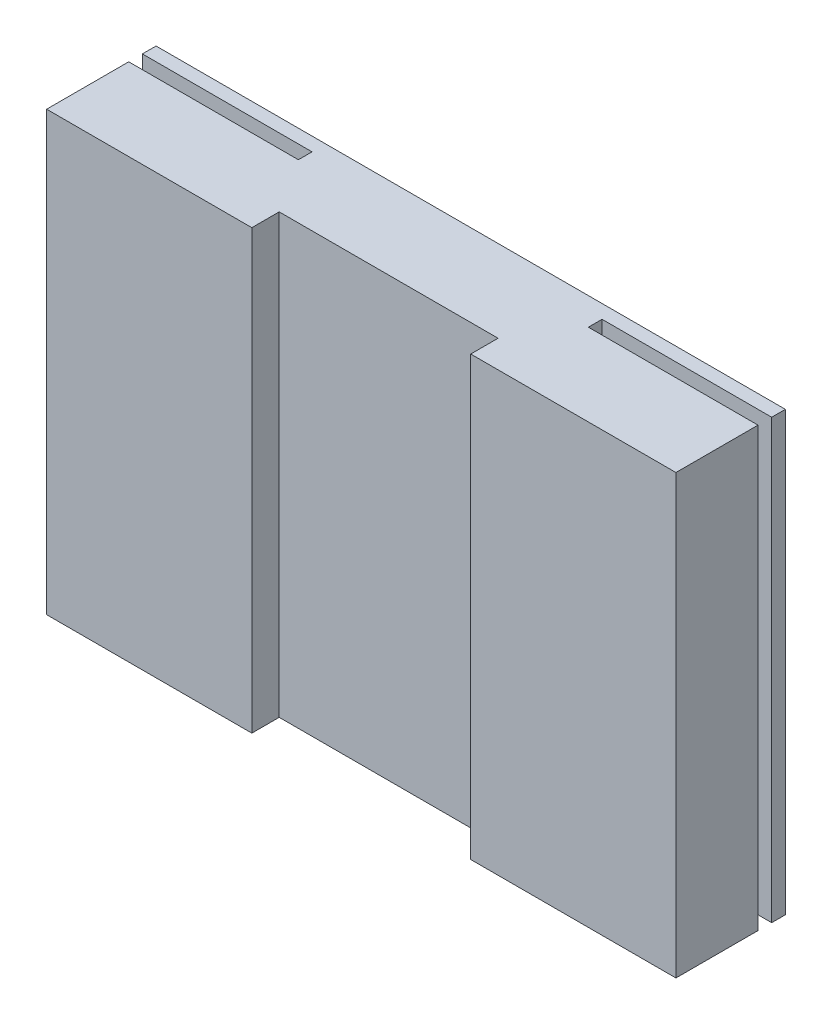
ISO-10303-21;
HEADER;
FILE_DESCRIPTION(('STEP AP214'),'2;1');
FILE_NAME('part.step','',(''),(''),'','','');
FILE_SCHEMA(('AUTOMOTIVE_DESIGN { 1 0 10303 214 1 1 1 1 }'));
ENDSEC;
DATA;
#1=APPLICATION_CONTEXT('core data for automotive mechanical design processes');
#2=APPLICATION_PROTOCOL_DEFINITION('international standard','automotive_design',2000,#1);
#3=PRODUCT_CONTEXT('',#1,'mechanical');
#4=PRODUCT('Part','Part','',(#3));
#5=PRODUCT_RELATED_PRODUCT_CATEGORY('part','',(#4));
#6=PRODUCT_DEFINITION_FORMATION('','',#4);
#7=PRODUCT_DEFINITION_CONTEXT('part definition',#1,'design');
#8=PRODUCT_DEFINITION('design','',#6,#7);
#9=PRODUCT_DEFINITION_SHAPE('','',#8);
#10=(LENGTH_UNIT() NAMED_UNIT(*) SI_UNIT(.MILLI.,.METRE.));
#11=(NAMED_UNIT(*) PLANE_ANGLE_UNIT() SI_UNIT($,.RADIAN.));
#12=(NAMED_UNIT(*) SI_UNIT($,.STERADIAN.) SOLID_ANGLE_UNIT());
#13=UNCERTAINTY_MEASURE_WITH_UNIT(LENGTH_MEASURE(1.E-05),#10,'distance_accuracy_value','');
#14=(GEOMETRIC_REPRESENTATION_CONTEXT(3) GLOBAL_UNCERTAINTY_ASSIGNED_CONTEXT((#13)) GLOBAL_UNIT_ASSIGNED_CONTEXT((#10,
#11,#12)) REPRESENTATION_CONTEXT('',''));
#15=CARTESIAN_POINT('',(0.,0.,0.));
#16=DIRECTION('',(0.,0.,1.));
#17=DIRECTION('',(1.,0.,0.));
#18=AXIS2_PLACEMENT_3D('',#15,#16,#17);
#19=CARTESIAN_POINT('',(18.25625,25.4,-2.38125));
#20=DIRECTION('',(0.,0.,1.));
#21=DIRECTION('',(1.,0.,0.));
#22=AXIS2_PLACEMENT_3D('',#19,#20,#21);
#23=PLANE('',#22);
#24=DIRECTION('',(0.,1.,0.));
#25=VECTOR('',#24,1.);
#26=CARTESIAN_POINT('',(-8.41375000000001,25.4,-2.38125));
#27=LINE('',#26,#25);
#28=CARTESIAN_POINT('',(-8.41375000000001,0.,-2.38125));
#29=VERTEX_POINT('',#28);
#30=CARTESIAN_POINT('',(-8.41375000000001,25.4,-2.38125));
#31=VERTEX_POINT('',#30);
#32=EDGE_CURVE('E177',#29,#31,#27,.T.);
#33=ORIENTED_EDGE('',*,*,#32,.F.);
#34=DIRECTION('',(-1.,0.,0.));
#35=VECTOR('',#34,1.);
#36=CARTESIAN_POINT('',(18.25625,0.,-2.38125));
#37=LINE('',#36,#35);
#38=CARTESIAN_POINT('',(-18.25625,0.,-2.38125));
#39=VERTEX_POINT('',#38);
#40=EDGE_CURVE('E275',#29,#39,#37,.T.);
#41=ORIENTED_EDGE('',*,*,#40,.T.);
#42=DIRECTION('',(0.,-1.,0.));
#43=VECTOR('',#42,1.);
#44=CARTESIAN_POINT('',(-18.25625,25.4,-2.38125));
#45=LINE('',#44,#43);
#46=CARTESIAN_POINT('',(-18.25625,25.4,-2.38125));
#47=VERTEX_POINT('',#46);
#48=EDGE_CURVE('E274',#47,#39,#45,.T.);
#49=ORIENTED_EDGE('',*,*,#48,.F.);
#50=DIRECTION('',(-1.,0.,0.));
#51=VECTOR('',#50,1.);
#52=CARTESIAN_POINT('',(18.25625,25.4,-2.38125));
#53=LINE('',#52,#51);
#54=EDGE_CURVE('E51',#31,#47,#53,.T.);
#55=ORIENTED_EDGE('',*,*,#54,.F.);
#56=EDGE_LOOP('',(#33,#41,#49,#55));
#57=FACE_BOUND('',#56,.T.);
#58=ADVANCED_FACE('F33',(#57),#23,.F.);
#59=DIRECTION('',(0.,-1.,0.));
#60=VECTOR('',#59,1.);
#61=CARTESIAN_POINT('',(8.41374999999999,25.4,-2.38125));
#62=LINE('',#61,#60);
#63=CARTESIAN_POINT('',(8.41374999999999,25.4,-2.38125));
#64=VERTEX_POINT('',#63);
#65=CARTESIAN_POINT('',(8.41374999999998,0.,-2.38125));
#66=VERTEX_POINT('',#65);
#67=EDGE_CURVE('E59',#64,#66,#62,.T.);
#68=ORIENTED_EDGE('',*,*,#67,.F.);
#69=CARTESIAN_POINT('',(18.25625,25.4,-2.38125));
#70=VERTEX_POINT('',#69);
#71=EDGE_CURVE('E272',#70,#64,#53,.T.);
#72=ORIENTED_EDGE('',*,*,#71,.F.);
#73=DIRECTION('',(0.,-1.,0.));
#74=VECTOR('',#73,1.);
#75=CARTESIAN_POINT('',(18.25625,25.4,-2.38125));
#76=LINE('',#75,#74);
#77=CARTESIAN_POINT('',(18.25625,0.,-2.38125));
#78=VERTEX_POINT('',#77);
#79=EDGE_CURVE('E285',#70,#78,#76,.T.);
#80=ORIENTED_EDGE('',*,*,#79,.T.);
#81=EDGE_CURVE('E263',#78,#66,#37,.T.);
#82=ORIENTED_EDGE('',*,*,#81,.T.);
#83=EDGE_LOOP('',(#68,#72,#80,#82));
#84=FACE_BOUND('',#83,.T.);
#85=ADVANCED_FACE('F339',(#84),#23,.F.);
#86=CARTESIAN_POINT('',(18.25625,25.4,2.38125));
#87=DIRECTION('',(0.,0.,-1.));
#88=DIRECTION('',(-1.,0.,0.));
#89=AXIS2_PLACEMENT_3D('',#86,#87,#88);
#90=PLANE('',#89);
#91=DIRECTION('',(1.,0.,0.));
#92=VECTOR('',#91,1.);
#93=CARTESIAN_POINT('',(18.25625,0.,2.38125));
#94=LINE('',#93,#92);
#95=CARTESIAN_POINT('',(-18.25625,0.,2.38125));
#96=VERTEX_POINT('',#95);
#97=CARTESIAN_POINT('',(-6.35000000000001,0.,2.38125));
#98=VERTEX_POINT('',#97);
#99=EDGE_CURVE('E300',#96,#98,#94,.T.);
#100=ORIENTED_EDGE('',*,*,#99,.T.);
#101=DIRECTION('',(0.,1.,0.));
#102=VECTOR('',#101,1.);
#103=CARTESIAN_POINT('',(-6.35000000000001,0.,2.38125));
#104=LINE('',#103,#102);
#105=CARTESIAN_POINT('',(-6.35000000000001,25.4,2.38125));
#106=VERTEX_POINT('',#105);
#107=EDGE_CURVE('E241',#98,#106,#104,.T.);
#108=ORIENTED_EDGE('',*,*,#107,.T.);
#109=DIRECTION('',(1.,0.,0.));
#110=VECTOR('',#109,1.);
#111=CARTESIAN_POINT('',(18.25625,25.4,2.38125));
#112=LINE('',#111,#110);
#113=CARTESIAN_POINT('',(-18.25625,25.4,2.38125));
#114=VERTEX_POINT('',#113);
#115=EDGE_CURVE('E264',#114,#106,#112,.T.);
#116=ORIENTED_EDGE('',*,*,#115,.F.);
#117=DIRECTION('',(0.,-1.,0.));
#118=VECTOR('',#117,1.);
#119=CARTESIAN_POINT('',(-18.25625,25.4,2.38125));
#120=LINE('',#119,#118);
#121=EDGE_CURVE('E11',#114,#96,#120,.T.);
#122=ORIENTED_EDGE('',*,*,#121,.T.);
#123=EDGE_LOOP('',(#100,#108,#116,#122));
#124=FACE_BOUND('',#123,.T.);
#125=ADVANCED_FACE('F311',(#124),#90,.F.);
#126=CARTESIAN_POINT('',(-18.25625,25.4,2.38125));
#127=DIRECTION('',(1.,0.,0.));
#128=DIRECTION('',(0.,0.,-1.));
#129=AXIS2_PLACEMENT_3D('',#126,#127,#128);
#130=PLANE('',#129);
#131=DIRECTION('',(0.,0.,1.));
#132=VECTOR('',#131,1.);
#133=CARTESIAN_POINT('',(-18.25625,0.,2.38125));
#134=LINE('',#133,#132);
#135=EDGE_CURVE('E252',#39,#96,#134,.T.);
#136=ORIENTED_EDGE('',*,*,#135,.T.);
#137=ORIENTED_EDGE('',*,*,#121,.F.);
#138=DIRECTION('',(0.,0.,1.));
#139=VECTOR('',#138,1.);
#140=CARTESIAN_POINT('',(-18.25625,25.4,2.38125));
#141=LINE('',#140,#139);
#142=EDGE_CURVE('E259',#47,#114,#141,.T.);
#143=ORIENTED_EDGE('',*,*,#142,.F.);
#144=ORIENTED_EDGE('',*,*,#48,.T.);
#145=EDGE_LOOP('',(#136,#137,#143,#144));
#146=FACE_BOUND('',#145,.T.);
#147=ADVANCED_FACE('F35',(#146),#130,.F.);
#148=CARTESIAN_POINT('',(6.34999999999999,25.4,2.38125));
#149=VERTEX_POINT('',#148);
#150=CARTESIAN_POINT('',(18.25625,25.4,2.38125));
#151=VERTEX_POINT('',#150);
#152=EDGE_CURVE('E262',#149,#151,#112,.T.);
#153=ORIENTED_EDGE('',*,*,#152,.F.);
#154=DIRECTION('',(0.,1.,0.));
#155=VECTOR('',#154,1.);
#156=CARTESIAN_POINT('',(6.34999999999999,0.,2.38125));
#157=LINE('',#156,#155);
#158=CARTESIAN_POINT('',(6.34999999999999,0.,2.38125));
#159=VERTEX_POINT('',#158);
#160=EDGE_CURVE('E255',#159,#149,#157,.T.);
#161=ORIENTED_EDGE('',*,*,#160,.F.);
#162=CARTESIAN_POINT('',(18.25625,0.,2.38125));
#163=VERTEX_POINT('',#162);
#164=EDGE_CURVE('E299',#159,#163,#94,.T.);
#165=ORIENTED_EDGE('',*,*,#164,.T.);
#166=DIRECTION('',(0.,-1.,0.));
#167=VECTOR('',#166,1.);
#168=CARTESIAN_POINT('',(18.25625,25.4,2.38125));
#169=LINE('',#168,#167);
#170=EDGE_CURVE('E43',#151,#163,#169,.T.);
#171=ORIENTED_EDGE('',*,*,#170,.F.);
#172=EDGE_LOOP('',(#153,#161,#165,#171));
#173=FACE_BOUND('',#172,.T.);
#174=ADVANCED_FACE('F347',(#173),#90,.F.);
#175=CARTESIAN_POINT('',(18.25625,25.4,2.38125));
#176=DIRECTION('',(-1.,0.,0.));
#177=DIRECTION('',(0.,0.,1.));
#178=AXIS2_PLACEMENT_3D('',#175,#176,#177);
#179=PLANE('',#178);
#180=DIRECTION('',(0.,0.,-1.));
#181=VECTOR('',#180,1.);
#182=CARTESIAN_POINT('',(18.25625,0.,2.38125));
#183=LINE('',#182,#181);
#184=EDGE_CURVE('E278',#163,#78,#183,.T.);
#185=ORIENTED_EDGE('',*,*,#184,.T.);
#186=ORIENTED_EDGE('',*,*,#79,.F.);
#187=DIRECTION('',(0.,0.,-1.));
#188=VECTOR('',#187,1.);
#189=CARTESIAN_POINT('',(18.25625,25.4,2.38125));
#190=LINE('',#189,#188);
#191=EDGE_CURVE('E267',#151,#70,#190,.T.);
#192=ORIENTED_EDGE('',*,*,#191,.F.);
#193=ORIENTED_EDGE('',*,*,#170,.T.);
#194=EDGE_LOOP('',(#185,#186,#192,#193));
#195=FACE_BOUND('',#194,.T.);
#196=ADVANCED_FACE('F293',(#195),#179,.F.);
#197=CARTESIAN_POINT('',(0.,25.4,0.));
#198=DIRECTION('',(0.,1.,0.));
#199=DIRECTION('',(0.,0.,1.));
#200=AXIS2_PLACEMENT_3D('',#197,#198,#199);
#201=PLANE('',#200);
#202=DIRECTION('',(0.,0.,1.));
#203=VECTOR('',#202,1.);
#204=CARTESIAN_POINT('',(-6.35000000000001,25.4,2.38125));
#205=LINE('',#204,#203);
#206=CARTESIAN_POINT('',(-6.35000000000001,25.4,0.793750000000001));
#207=VERTEX_POINT('',#206);
#208=EDGE_CURVE('E242',#207,#106,#205,.T.);
#209=ORIENTED_EDGE('',*,*,#208,.F.);
#210=DIRECTION('',(-1.,0.,0.));
#211=VECTOR('',#210,1.);
#212=CARTESIAN_POINT('',(-6.35000000000001,25.4,0.793750000000001));
#213=LINE('',#212,#211);
#214=CARTESIAN_POINT('',(6.34999999999999,25.4,0.793750000000001));
#215=VERTEX_POINT('',#214);
#216=EDGE_CURVE('E236',#215,#207,#213,.T.);
#217=ORIENTED_EDGE('',*,*,#216,.F.);
#218=DIRECTION('',(0.,0.,-1.));
#219=VECTOR('',#218,1.);
#220=CARTESIAN_POINT('',(6.34999999999999,25.4,0.793750000000001));
#221=LINE('',#220,#219);
#222=EDGE_CURVE('E244',#149,#215,#221,.T.);
#223=ORIENTED_EDGE('',*,*,#222,.F.);
#224=ORIENTED_EDGE('',*,*,#152,.T.);
#225=ORIENTED_EDGE('',*,*,#191,.T.);
#226=ORIENTED_EDGE('',*,*,#71,.T.);
#227=DIRECTION('',(0.,0.,1.));
#228=VECTOR('',#227,1.);
#229=CARTESIAN_POINT('',(8.41374999999999,25.4,-3.175));
#230=LINE('',#229,#228);
#231=CARTESIAN_POINT('',(8.41374999999999,25.4,-3.175));
#232=VERTEX_POINT('',#231);
#233=EDGE_CURVE('E314',#232,#64,#230,.T.);
#234=ORIENTED_EDGE('',*,*,#233,.F.);
#235=DIRECTION('',(1.,0.,0.));
#236=VECTOR('',#235,1.);
#237=CARTESIAN_POINT('',(-18.25625,25.4,-3.175));
#238=LINE('',#237,#236);
#239=CARTESIAN_POINT('',(18.25625,25.4,-3.17500000000001));
#240=VERTEX_POINT('',#239);
#241=EDGE_CURVE('E188',#232,#240,#238,.T.);
#242=ORIENTED_EDGE('',*,*,#241,.T.);
#243=DIRECTION('',(0.,0.,1.));
#244=VECTOR('',#243,1.);
#245=CARTESIAN_POINT('',(18.25625,25.4,-3.96875000000001));
#246=LINE('',#245,#244);
#247=CARTESIAN_POINT('',(18.25625,25.4,-3.96875000000001));
#248=VERTEX_POINT('',#247);
#249=EDGE_CURVE('E195',#248,#240,#246,.T.);
#250=ORIENTED_EDGE('',*,*,#249,.F.);
#251=DIRECTION('',(1.,0.,0.));
#252=VECTOR('',#251,1.);
#253=CARTESIAN_POINT('',(-18.25625,25.4,-3.96875));
#254=LINE('',#253,#252);
#255=CARTESIAN_POINT('',(-18.25625,25.4,-3.96875));
#256=VERTEX_POINT('',#255);
#257=EDGE_CURVE('E168',#256,#248,#254,.T.);
#258=ORIENTED_EDGE('',*,*,#257,.F.);
#259=DIRECTION('',(0.,0.,1.));
#260=VECTOR('',#259,1.);
#261=CARTESIAN_POINT('',(-18.25625,25.4,-3.96875));
#262=LINE('',#261,#260);
#263=CARTESIAN_POINT('',(-18.25625,25.4,-3.175));
#264=VERTEX_POINT('',#263);
#265=EDGE_CURVE('E181',#256,#264,#262,.T.);
#266=ORIENTED_EDGE('',*,*,#265,.T.);
#267=CARTESIAN_POINT('',(-8.41375000000001,25.4,-3.175));
#268=VERTEX_POINT('',#267);
#269=EDGE_CURVE('E172',#264,#268,#238,.T.);
#270=ORIENTED_EDGE('',*,*,#269,.T.);
#271=DIRECTION('',(0.,0.,1.));
#272=VECTOR('',#271,1.);
#273=CARTESIAN_POINT('',(-8.41375000000001,25.4,-3.175));
#274=LINE('',#273,#272);
#275=EDGE_CURVE('E245',#268,#31,#274,.T.);
#276=ORIENTED_EDGE('',*,*,#275,.T.);
#277=ORIENTED_EDGE('',*,*,#54,.T.);
#278=ORIENTED_EDGE('',*,*,#142,.T.);
#279=ORIENTED_EDGE('',*,*,#115,.T.);
#280=EDGE_LOOP('',(#209,#217,#223,#224,#225,#226,#234,#242,#250,#258,#266,#270,#276,#277,#278,#279));
#281=FACE_BOUND('',#280,.T.);
#282=ADVANCED_FACE('F202',(#281),#201,.T.);
#283=CARTESIAN_POINT('',(0.,0.,0.));
#284=DIRECTION('',(0.,1.,0.));
#285=DIRECTION('',(0.,0.,1.));
#286=AXIS2_PLACEMENT_3D('',#283,#284,#285);
#287=PLANE('',#286);
#288=DIRECTION('',(-1.,0.,0.));
#289=VECTOR('',#288,1.);
#290=CARTESIAN_POINT('',(-6.35000000000001,0.,0.793750000000001));
#291=LINE('',#290,#289);
#292=CARTESIAN_POINT('',(6.34999999999999,0.,0.793750000000001));
#293=VERTEX_POINT('',#292);
#294=CARTESIAN_POINT('',(-6.35000000000001,0.,0.793750000000001));
#295=VERTEX_POINT('',#294);
#296=EDGE_CURVE('E239',#293,#295,#291,.T.);
#297=ORIENTED_EDGE('',*,*,#296,.T.);
#298=DIRECTION('',(0.,0.,1.));
#299=VECTOR('',#298,1.);
#300=CARTESIAN_POINT('',(-6.35000000000001,0.,2.38125));
#301=LINE('',#300,#299);
#302=EDGE_CURVE('E232',#295,#98,#301,.T.);
#303=ORIENTED_EDGE('',*,*,#302,.T.);
#304=ORIENTED_EDGE('',*,*,#99,.F.);
#305=ORIENTED_EDGE('',*,*,#135,.F.);
#306=ORIENTED_EDGE('',*,*,#40,.F.);
#307=DIRECTION('',(0.,0.,1.));
#308=VECTOR('',#307,1.);
#309=CARTESIAN_POINT('',(-8.41375000000001,0.,-3.175));
#310=LINE('',#309,#308);
#311=CARTESIAN_POINT('',(-8.41375000000001,0.,-3.175));
#312=VERTEX_POINT('',#311);
#313=EDGE_CURVE('E215',#312,#29,#310,.T.);
#314=ORIENTED_EDGE('',*,*,#313,.F.);
#315=DIRECTION('',(-1.,0.,0.));
#316=VECTOR('',#315,1.);
#317=CARTESIAN_POINT('',(-18.25625,0.,-3.175));
#318=LINE('',#317,#316);
#319=CARTESIAN_POINT('',(-18.25625,0.,-3.175));
#320=VERTEX_POINT('',#319);
#321=EDGE_CURVE('E210',#312,#320,#318,.T.);
#322=ORIENTED_EDGE('',*,*,#321,.T.);
#323=DIRECTION('',(0.,0.,1.));
#324=VECTOR('',#323,1.);
#325=CARTESIAN_POINT('',(-18.25625,0.,-3.96875));
#326=LINE('',#325,#324);
#327=CARTESIAN_POINT('',(-18.25625,0.,-3.96875));
#328=VERTEX_POINT('',#327);
#329=EDGE_CURVE('E159',#328,#320,#326,.T.);
#330=ORIENTED_EDGE('',*,*,#329,.F.);
#331=DIRECTION('',(-1.,0.,0.));
#332=VECTOR('',#331,1.);
#333=CARTESIAN_POINT('',(-18.25625,0.,-3.96875));
#334=LINE('',#333,#332);
#335=CARTESIAN_POINT('',(18.25625,0.,-3.96875000000001));
#336=VERTEX_POINT('',#335);
#337=EDGE_CURVE('E150',#336,#328,#334,.T.);
#338=ORIENTED_EDGE('',*,*,#337,.F.);
#339=DIRECTION('',(0.,0.,1.));
#340=VECTOR('',#339,1.);
#341=CARTESIAN_POINT('',(18.25625,0.,-3.96875000000001));
#342=LINE('',#341,#340);
#343=CARTESIAN_POINT('',(18.25625,0.,-3.17500000000001));
#344=VERTEX_POINT('',#343);
#345=EDGE_CURVE('E156',#336,#344,#342,.T.);
#346=ORIENTED_EDGE('',*,*,#345,.T.);
#347=CARTESIAN_POINT('',(8.41374999999999,0.,-3.175));
#348=VERTEX_POINT('',#347);
#349=EDGE_CURVE('E321',#344,#348,#318,.T.);
#350=ORIENTED_EDGE('',*,*,#349,.T.);
#351=DIRECTION('',(0.,0.,1.));
#352=VECTOR('',#351,1.);
#353=CARTESIAN_POINT('',(8.41374999999998,0.,-3.175));
#354=LINE('',#353,#352);
#355=EDGE_CURVE('E225',#348,#66,#354,.T.);
#356=ORIENTED_EDGE('',*,*,#355,.T.);
#357=ORIENTED_EDGE('',*,*,#81,.F.);
#358=ORIENTED_EDGE('',*,*,#184,.F.);
#359=ORIENTED_EDGE('',*,*,#164,.F.);
#360=DIRECTION('',(0.,0.,-1.));
#361=VECTOR('',#360,1.);
#362=CARTESIAN_POINT('',(6.34999999999999,0.,0.793750000000001));
#363=LINE('',#362,#361);
#364=EDGE_CURVE('E235',#159,#293,#363,.T.);
#365=ORIENTED_EDGE('',*,*,#364,.T.);
#366=EDGE_LOOP('',(#297,#303,#304,#305,#306,#314,#322,#330,#338,#346,#350,#356,#357,#358,#359,#365));
#367=FACE_BOUND('',#366,.T.);
#368=ADVANCED_FACE('F153',(#367),#287,.F.);
#369=CARTESIAN_POINT('',(-6.35000000000001,0.,2.38125));
#370=DIRECTION('',(-1.,0.,0.));
#371=DIRECTION('',(0.,0.,1.));
#372=AXIS2_PLACEMENT_3D('',#369,#370,#371);
#373=PLANE('',#372);
#374=ORIENTED_EDGE('',*,*,#208,.T.);
#375=ORIENTED_EDGE('',*,*,#107,.F.);
#376=ORIENTED_EDGE('',*,*,#302,.F.);
#377=DIRECTION('',(0.,1.,0.));
#378=VECTOR('',#377,1.);
#379=CARTESIAN_POINT('',(-6.35000000000001,0.,0.793750000000001));
#380=LINE('',#379,#378);
#381=EDGE_CURVE('E250',#295,#207,#380,.T.);
#382=ORIENTED_EDGE('',*,*,#381,.T.);
#383=EDGE_LOOP('',(#374,#375,#376,#382));
#384=FACE_BOUND('',#383,.T.);
#385=ADVANCED_FACE('F365',(#384),#373,.F.);
#386=CARTESIAN_POINT('',(-6.35000000000001,0.,0.793750000000001));
#387=DIRECTION('',(0.,0.,-1.));
#388=DIRECTION('',(-1.,0.,0.));
#389=AXIS2_PLACEMENT_3D('',#386,#387,#388);
#390=PLANE('',#389);
#391=ORIENTED_EDGE('',*,*,#216,.T.);
#392=ORIENTED_EDGE('',*,*,#381,.F.);
#393=ORIENTED_EDGE('',*,*,#296,.F.);
#394=DIRECTION('',(0.,1.,0.));
#395=VECTOR('',#394,1.);
#396=CARTESIAN_POINT('',(6.34999999999999,0.,0.793750000000001));
#397=LINE('',#396,#395);
#398=EDGE_CURVE('E253',#293,#215,#397,.T.);
#399=ORIENTED_EDGE('',*,*,#398,.T.);
#400=EDGE_LOOP('',(#391,#392,#393,#399));
#401=FACE_BOUND('',#400,.T.);
#402=ADVANCED_FACE('F363',(#401),#390,.F.);
#403=CARTESIAN_POINT('',(6.34999999999999,0.,0.793750000000001));
#404=DIRECTION('',(1.,0.,0.));
#405=DIRECTION('',(0.,0.,-1.));
#406=AXIS2_PLACEMENT_3D('',#403,#404,#405);
#407=PLANE('',#406);
#408=ORIENTED_EDGE('',*,*,#222,.T.);
#409=ORIENTED_EDGE('',*,*,#398,.F.);
#410=ORIENTED_EDGE('',*,*,#364,.F.);
#411=ORIENTED_EDGE('',*,*,#160,.T.);
#412=EDGE_LOOP('',(#408,#409,#410,#411));
#413=FACE_BOUND('',#412,.T.);
#414=ADVANCED_FACE('F361',(#413),#407,.F.);
#415=CARTESIAN_POINT('',(-8.41375000000001,25.4,-3.175));
#416=DIRECTION('',(1.,0.,0.));
#417=DIRECTION('',(0.,1.,0.));
#418=AXIS2_PLACEMENT_3D('',#415,#416,#417);
#419=PLANE('',#418);
#420=ORIENTED_EDGE('',*,*,#32,.T.);
#421=ORIENTED_EDGE('',*,*,#275,.F.);
#422=DIRECTION('',(0.,1.,0.));
#423=VECTOR('',#422,1.);
#424=CARTESIAN_POINT('',(-8.41375000000001,25.4,-3.175));
#425=LINE('',#424,#423);
#426=EDGE_CURVE('E37',#312,#268,#425,.T.);
#427=ORIENTED_EDGE('',*,*,#426,.F.);
#428=ORIENTED_EDGE('',*,*,#313,.T.);
#429=EDGE_LOOP('',(#420,#421,#427,#428));
#430=FACE_BOUND('',#429,.T.);
#431=ADVANCED_FACE('F312',(#430),#419,.F.);
#432=CARTESIAN_POINT('',(8.41374999999999,25.4,-3.175));
#433=DIRECTION('',(-1.,0.,0.));
#434=DIRECTION('',(0.,-1.,0.));
#435=AXIS2_PLACEMENT_3D('',#432,#433,#434);
#436=PLANE('',#435);
#437=ORIENTED_EDGE('',*,*,#67,.T.);
#438=ORIENTED_EDGE('',*,*,#355,.F.);
#439=DIRECTION('',(0.,-1.,0.));
#440=VECTOR('',#439,1.);
#441=CARTESIAN_POINT('',(8.41374999999999,25.4,-3.175));
#442=LINE('',#441,#440);
#443=EDGE_CURVE('E213',#232,#348,#442,.T.);
#444=ORIENTED_EDGE('',*,*,#443,.F.);
#445=ORIENTED_EDGE('',*,*,#233,.T.);
#446=EDGE_LOOP('',(#437,#438,#444,#445));
#447=FACE_BOUND('',#446,.T.);
#448=ADVANCED_FACE('F332',(#447),#436,.F.);
#449=CARTESIAN_POINT('',(0.,0.,-3.175));
#450=DIRECTION('',(0.,0.,1.));
#451=DIRECTION('',(1.,0.,0.));
#452=AXIS2_PLACEMENT_3D('',#449,#450,#451);
#453=PLANE('',#452);
#454=ORIENTED_EDGE('',*,*,#321,.F.);
#455=ORIENTED_EDGE('',*,*,#426,.T.);
#456=ORIENTED_EDGE('',*,*,#269,.F.);
#457=DIRECTION('',(0.,1.,0.));
#458=VECTOR('',#457,1.);
#459=CARTESIAN_POINT('',(-18.25625,25.4,-3.175));
#460=LINE('',#459,#458);
#461=EDGE_CURVE('E193',#320,#264,#460,.T.);
#462=ORIENTED_EDGE('',*,*,#461,.F.);
#463=EDGE_LOOP('',(#454,#455,#456,#462));
#464=FACE_BOUND('',#463,.T.);
#465=ADVANCED_FACE('F208',(#464),#453,.T.);
#466=CARTESIAN_POINT('',(18.25625,25.4,-3.96875000000001));
#467=DIRECTION('',(-1.,0.,0.));
#468=DIRECTION('',(0.,0.,1.));
#469=AXIS2_PLACEMENT_3D('',#466,#467,#468);
#470=PLANE('',#469);
#471=DIRECTION('',(0.,-1.,0.));
#472=VECTOR('',#471,1.);
#473=CARTESIAN_POINT('',(18.25625,25.4,-3.17500000000001));
#474=LINE('',#473,#472);
#475=EDGE_CURVE('E176',#240,#344,#474,.T.);
#476=ORIENTED_EDGE('',*,*,#475,.T.);
#477=ORIENTED_EDGE('',*,*,#345,.F.);
#478=DIRECTION('',(0.,-1.,0.));
#479=VECTOR('',#478,1.);
#480=CARTESIAN_POINT('',(18.25625,25.4,-3.96875000000001));
#481=LINE('',#480,#479);
#482=EDGE_CURVE('E163',#248,#336,#481,.T.);
#483=ORIENTED_EDGE('',*,*,#482,.F.);
#484=ORIENTED_EDGE('',*,*,#249,.T.);
#485=EDGE_LOOP('',(#476,#477,#483,#484));
#486=FACE_BOUND('',#485,.T.);
#487=ADVANCED_FACE('F174',(#486),#470,.F.);
#488=CARTESIAN_POINT('',(-18.25625,25.4,-3.96875));
#489=DIRECTION('',(1.,0.,0.));
#490=DIRECTION('',(0.,0.,-1.));
#491=AXIS2_PLACEMENT_3D('',#488,#489,#490);
#492=PLANE('',#491);
#493=ORIENTED_EDGE('',*,*,#461,.T.);
#494=ORIENTED_EDGE('',*,*,#265,.F.);
#495=DIRECTION('',(0.,1.,0.));
#496=VECTOR('',#495,1.);
#497=CARTESIAN_POINT('',(-18.25625,25.4,-3.96875));
#498=LINE('',#497,#496);
#499=EDGE_CURVE('E162',#328,#256,#498,.T.);
#500=ORIENTED_EDGE('',*,*,#499,.F.);
#501=ORIENTED_EDGE('',*,*,#329,.T.);
#502=EDGE_LOOP('',(#493,#494,#500,#501));
#503=FACE_BOUND('',#502,.T.);
#504=ADVANCED_FACE('F327',(#503),#492,.F.);
#505=CARTESIAN_POINT('',(0.,0.,-3.96875));
#506=DIRECTION('',(0.,0.,1.));
#507=DIRECTION('',(1.,0.,0.));
#508=AXIS2_PLACEMENT_3D('',#505,#506,#507);
#509=PLANE('',#508);
#510=ORIENTED_EDGE('',*,*,#482,.T.);
#511=ORIENTED_EDGE('',*,*,#337,.T.);
#512=ORIENTED_EDGE('',*,*,#499,.T.);
#513=ORIENTED_EDGE('',*,*,#257,.T.);
#514=EDGE_LOOP('',(#510,#511,#512,#513));
#515=FACE_BOUND('',#514,.T.);
#516=ADVANCED_FACE('F166',(#515),#509,.F.);
#517=ORIENTED_EDGE('',*,*,#241,.F.);
#518=ORIENTED_EDGE('',*,*,#443,.T.);
#519=ORIENTED_EDGE('',*,*,#349,.F.);
#520=ORIENTED_EDGE('',*,*,#475,.F.);
#521=EDGE_LOOP('',(#517,#518,#519,#520));
#522=FACE_BOUND('',#521,.T.);
#523=ADVANCED_FACE('F330',(#522),#453,.T.);
#524=CLOSED_SHELL('',(#58,#85,#125,#147,#174,#196,#282,#368,#385,#402,#414,#431,#448,#465,#487,
#504,#516,#523));
#525=MANIFOLD_SOLID_BREP('B2',#524);
#526=ADVANCED_BREP_SHAPE_REPRESENTATION('',(#18,#525),#14);
#527=SHAPE_DEFINITION_REPRESENTATION(#9,#526);
ENDSEC;
END-ISO-10303-21;
